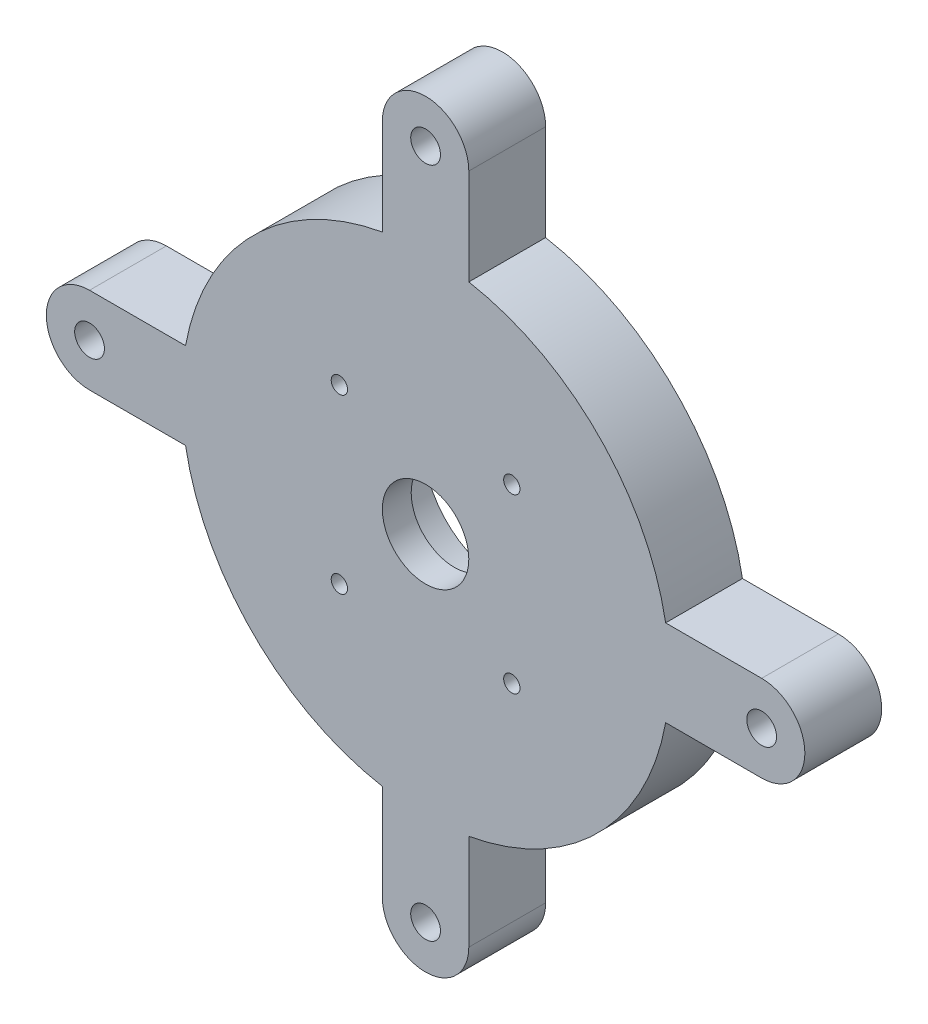
ISO-10303-21;
HEADER;
FILE_DESCRIPTION(('STEP AP214'),'2;1');
FILE_NAME('part.step','',(''),(''),'','','');
FILE_SCHEMA(('AUTOMOTIVE_DESIGN { 1 0 10303 214 1 1 1 1 }'));
ENDSEC;
DATA;
#1=APPLICATION_CONTEXT('core data for automotive mechanical design processes');
#2=APPLICATION_PROTOCOL_DEFINITION('international standard','automotive_design',2000,#1);
#3=PRODUCT_CONTEXT('',#1,'mechanical');
#4=PRODUCT('Part','Part','',(#3));
#5=PRODUCT_RELATED_PRODUCT_CATEGORY('part','',(#4));
#6=PRODUCT_DEFINITION_FORMATION('','',#4);
#7=PRODUCT_DEFINITION_CONTEXT('part definition',#1,'design');
#8=PRODUCT_DEFINITION('design','',#6,#7);
#9=PRODUCT_DEFINITION_SHAPE('','',#8);
#10=(LENGTH_UNIT() NAMED_UNIT(*) SI_UNIT(.MILLI.,.METRE.));
#11=(NAMED_UNIT(*) PLANE_ANGLE_UNIT() SI_UNIT($,.RADIAN.));
#12=(NAMED_UNIT(*) SI_UNIT($,.STERADIAN.) SOLID_ANGLE_UNIT());
#13=UNCERTAINTY_MEASURE_WITH_UNIT(LENGTH_MEASURE(1.E-05),#10,'distance_accuracy_value','');
#14=(GEOMETRIC_REPRESENTATION_CONTEXT(3) GLOBAL_UNCERTAINTY_ASSIGNED_CONTEXT((#13)) GLOBAL_UNIT_ASSIGNED_CONTEXT((#10,
#11,#12)) REPRESENTATION_CONTEXT('',''));
#15=CARTESIAN_POINT('',(0.,0.,0.));
#16=DIRECTION('',(0.,0.,1.));
#17=DIRECTION('',(1.,0.,0.));
#18=AXIS2_PLACEMENT_3D('',#15,#16,#17);
#19=CARTESIAN_POINT('',(0.,0.,8.));
#20=DIRECTION('',(0.,0.,-1.));
#21=DIRECTION('',(-1.,0.,0.));
#22=AXIS2_PLACEMENT_3D('',#19,#20,#21);
#23=CYLINDRICAL_SURFACE('',#22,4.5);
#24=CARTESIAN_POINT('',(0.,0.,8.));
#25=DIRECTION('',(0.,0.,1.));
#26=DIRECTION('',(1.,0.,0.));
#27=AXIS2_PLACEMENT_3D('',#24,#25,#26);
#28=CIRCLE('',#27,4.5);
#29=CARTESIAN_POINT('',(4.5,0.,8.));
#30=VERTEX_POINT('',#29);
#31=EDGE_CURVE('E308',#30,#30,#28,.T.);
#32=ORIENTED_EDGE('',*,*,#31,.T.);
#33=EDGE_LOOP('',(#32));
#34=FACE_BOUND('',#33,.T.);
#35=CARTESIAN_POINT('',(0.,0.,5.));
#36=DIRECTION('',(0.,0.,-1.));
#37=DIRECTION('',(-1.,0.,0.));
#38=AXIS2_PLACEMENT_3D('',#35,#36,#37);
#39=CIRCLE('',#38,4.5);
#40=CARTESIAN_POINT('',(-4.5,0.,5.));
#41=VERTEX_POINT('',#40);
#42=EDGE_CURVE('E252',#41,#41,#39,.T.);
#43=ORIENTED_EDGE('',*,*,#42,.T.);
#44=EDGE_LOOP('',(#43));
#45=FACE_BOUND('',#44,.T.);
#46=ADVANCED_FACE('F37',(#34,#45),#23,.F.);
#47=CARTESIAN_POINT('',(0.,0.,8.));
#48=DIRECTION('',(0.,0.,-1.));
#49=DIRECTION('',(-1.,0.,0.));
#50=AXIS2_PLACEMENT_3D('',#47,#48,#49);
#51=PLANE('',#50);
#52=CARTESIAN_POINT('',(0.,0.,8.));
#53=DIRECTION('',(0.,0.,1.));
#54=DIRECTION('',(-1.,0.,0.));
#55=AXIS2_PLACEMENT_3D('',#52,#53,#54);
#56=CIRCLE('',#55,25.4017715917611);
#57=CARTESIAN_POINT('',(-4.49999999999992,25.,8.));
#58=VERTEX_POINT('',#57);
#59=CARTESIAN_POINT('',(-25.,4.49999999999999,8.));
#60=VERTEX_POINT('',#59);
#61=EDGE_CURVE('E216',#58,#60,#56,.T.);
#62=ORIENTED_EDGE('',*,*,#61,.T.);
#63=DIRECTION('',(-1.,0.,0.));
#64=VECTOR('',#63,1.);
#65=CARTESIAN_POINT('',(-35.,4.5,8.));
#66=LINE('',#65,#64);
#67=CARTESIAN_POINT('',(-35.,4.5,8.));
#68=VERTEX_POINT('',#67);
#69=EDGE_CURVE('E123',#60,#68,#66,.T.);
#70=ORIENTED_EDGE('',*,*,#69,.T.);
#71=CARTESIAN_POINT('',(-35.,0.,8.));
#72=DIRECTION('',(0.,0.,1.));
#73=DIRECTION('',(1.,0.,0.));
#74=AXIS2_PLACEMENT_3D('',#71,#72,#73);
#75=CIRCLE('',#74,4.5);
#76=CARTESIAN_POINT('',(-35.,-4.5,8.));
#77=VERTEX_POINT('',#76);
#78=EDGE_CURVE('E318',#68,#77,#75,.T.);
#79=ORIENTED_EDGE('',*,*,#78,.T.);
#80=DIRECTION('',(1.,0.,0.));
#81=VECTOR('',#80,1.);
#82=CARTESIAN_POINT('',(-25.,-4.50000000000001,8.));
#83=LINE('',#82,#81);
#84=CARTESIAN_POINT('',(-25.,-4.5,8.));
#85=VERTEX_POINT('',#84);
#86=EDGE_CURVE('E320',#77,#85,#83,.T.);
#87=ORIENTED_EDGE('',*,*,#86,.T.);
#88=CARTESIAN_POINT('',(0.,0.,8.));
#89=DIRECTION('',(0.,0.,1.));
#90=DIRECTION('',(1.,0.,0.));
#91=AXIS2_PLACEMENT_3D('',#88,#89,#90);
#92=CIRCLE('',#91,25.4017715917611);
#93=CARTESIAN_POINT('',(-4.50000000000026,-25.,8.));
#94=VERTEX_POINT('',#93);
#95=EDGE_CURVE('E322',#85,#94,#92,.T.);
#96=ORIENTED_EDGE('',*,*,#95,.T.);
#97=DIRECTION('',(0.,-1.,0.));
#98=VECTOR('',#97,1.);
#99=CARTESIAN_POINT('',(-4.50000000000024,-35.,8.));
#100=LINE('',#99,#98);
#101=CARTESIAN_POINT('',(-4.50000000000024,-35.,8.));
#102=VERTEX_POINT('',#101);
#103=EDGE_CURVE('E324',#94,#102,#100,.T.);
#104=ORIENTED_EDGE('',*,*,#103,.T.);
#105=CARTESIAN_POINT('',(-2.4735030847392E-13,-35.,8.));
#106=DIRECTION('',(0.,0.,1.));
#107=DIRECTION('',(1.,0.,0.));
#108=AXIS2_PLACEMENT_3D('',#105,#106,#107);
#109=CIRCLE('',#108,4.5);
#110=CARTESIAN_POINT('',(4.49999999999975,-35.,8.));
#111=VERTEX_POINT('',#110);
#112=EDGE_CURVE('E326',#102,#111,#109,.T.);
#113=ORIENTED_EDGE('',*,*,#112,.T.);
#114=DIRECTION('',(0.,1.,0.));
#115=VECTOR('',#114,1.);
#116=CARTESIAN_POINT('',(4.49999999999974,-25.,8.));
#117=LINE('',#116,#115);
#118=CARTESIAN_POINT('',(4.49999999999974,-25.,8.));
#119=VERTEX_POINT('',#118);
#120=EDGE_CURVE('E328',#111,#119,#117,.T.);
#121=ORIENTED_EDGE('',*,*,#120,.T.);
#122=CARTESIAN_POINT('',(0.,0.,8.));
#123=DIRECTION('',(0.,0.,1.));
#124=DIRECTION('',(1.,0.,0.));
#125=AXIS2_PLACEMENT_3D('',#122,#123,#124);
#126=CIRCLE('',#125,25.4017715917611);
#127=CARTESIAN_POINT('',(25.,-4.50000000000017,8.));
#128=VERTEX_POINT('',#127);
#129=EDGE_CURVE('E330',#119,#128,#126,.T.);
#130=ORIENTED_EDGE('',*,*,#129,.T.);
#131=DIRECTION('',(1.,0.,0.));
#132=VECTOR('',#131,1.);
#133=CARTESIAN_POINT('',(34.9999999999997,-4.5000000000002,8.));
#134=LINE('',#133,#132);
#135=CARTESIAN_POINT('',(34.9999999999997,-4.5000000000002,8.));
#136=VERTEX_POINT('',#135);
#137=EDGE_CURVE('E332',#128,#136,#134,.T.);
#138=ORIENTED_EDGE('',*,*,#137,.T.);
#139=CARTESIAN_POINT('',(34.9999999999997,-2.06125353473007E-13,8.));
#140=DIRECTION('',(0.,0.,1.));
#141=DIRECTION('',(1.,0.,0.));
#142=AXIS2_PLACEMENT_3D('',#139,#140,#141);
#143=CIRCLE('',#142,4.5);
#144=CARTESIAN_POINT('',(34.9999999999997,4.49999999999979,8.));
#145=VERTEX_POINT('',#144);
#146=EDGE_CURVE('E334',#136,#145,#143,.T.);
#147=ORIENTED_EDGE('',*,*,#146,.T.);
#148=DIRECTION('',(-1.,0.,0.));
#149=VECTOR('',#148,1.);
#150=CARTESIAN_POINT('',(25.,4.49999999999983,8.));
#151=LINE('',#150,#149);
#152=CARTESIAN_POINT('',(25.,4.49999999999983,8.));
#153=VERTEX_POINT('',#152);
#154=EDGE_CURVE('E336',#145,#153,#151,.T.);
#155=ORIENTED_EDGE('',*,*,#154,.T.);
#156=CARTESIAN_POINT('',(0.,0.,8.));
#157=DIRECTION('',(0.,0.,1.));
#158=DIRECTION('',(1.,0.,0.));
#159=AXIS2_PLACEMENT_3D('',#156,#157,#158);
#160=CIRCLE('',#159,25.4017715917611);
#161=CARTESIAN_POINT('',(4.50000000000008,25.,8.));
#162=VERTEX_POINT('',#161);
#163=EDGE_CURVE('E167',#153,#162,#160,.T.);
#164=ORIENTED_EDGE('',*,*,#163,.T.);
#165=DIRECTION('',(0.,1.,0.));
#166=VECTOR('',#165,1.);
#167=CARTESIAN_POINT('',(4.49999999999995,34.9999999999997,8.));
#168=LINE('',#167,#166);
#169=CARTESIAN_POINT('',(4.49999999999995,34.9999999999997,8.));
#170=VERTEX_POINT('',#169);
#171=EDGE_CURVE('E160',#162,#170,#168,.T.);
#172=ORIENTED_EDGE('',*,*,#171,.T.);
#173=CARTESIAN_POINT('',(0.,34.9999999999997,8.));
#174=DIRECTION('',(0.,0.,1.));
#175=DIRECTION('',(1.,0.,0.));
#176=AXIS2_PLACEMENT_3D('',#173,#174,#175);
#177=CIRCLE('',#176,4.5);
#178=CARTESIAN_POINT('',(-4.50000000000004,34.9999999999997,8.));
#179=VERTEX_POINT('',#178);
#180=EDGE_CURVE('E165',#170,#179,#177,.T.);
#181=ORIENTED_EDGE('',*,*,#180,.T.);
#182=DIRECTION('',(0.,-1.,0.));
#183=VECTOR('',#182,1.);
#184=CARTESIAN_POINT('',(-4.49999999999992,25.,8.));
#185=LINE('',#184,#183);
#186=EDGE_CURVE('E56',#179,#58,#185,.T.);
#187=ORIENTED_EDGE('',*,*,#186,.T.);
#188=EDGE_LOOP('',(#62,#70,#79,#87,#96,#104,#113,#121,#130,#138,#147,#155,#164,#172,#181,#187));
#189=FACE_BOUND('',#188,.T.);
#190=CARTESIAN_POINT('',(8.98025612106914,8.98025612106917,8.));
#191=DIRECTION('',(0.,0.,1.));
#192=DIRECTION('',(1.,0.,0.));
#193=AXIS2_PLACEMENT_3D('',#190,#191,#192);
#194=CIRCLE('',#193,0.85);
#195=CARTESIAN_POINT('',(9.83025612106914,8.98025612106917,8.));
#196=VERTEX_POINT('',#195);
#197=EDGE_CURVE('E189',#196,#196,#194,.T.);
#198=ORIENTED_EDGE('',*,*,#197,.F.);
#199=EDGE_LOOP('',(#198));
#200=FACE_BOUND('',#199,.T.);
#201=ORIENTED_EDGE('',*,*,#31,.F.);
#202=EDGE_LOOP('',(#201));
#203=FACE_BOUND('',#202,.T.);
#204=CARTESIAN_POINT('',(0.,34.9999999999997,8.));
#205=DIRECTION('',(0.,0.,1.));
#206=DIRECTION('',(1.,0.,0.));
#207=AXIS2_PLACEMENT_3D('',#204,#205,#206);
#208=CIRCLE('',#207,1.54999999999999);
#209=CARTESIAN_POINT('',(1.54999999999995,34.9999999999997,8.));
#210=VERTEX_POINT('',#209);
#211=EDGE_CURVE('E305',#210,#210,#208,.T.);
#212=ORIENTED_EDGE('',*,*,#211,.F.);
#213=EDGE_LOOP('',(#212));
#214=FACE_BOUND('',#213,.T.);
#215=CARTESIAN_POINT('',(-35.,0.,8.));
#216=DIRECTION('',(0.,0.,1.));
#217=DIRECTION('',(1.,0.,0.));
#218=AXIS2_PLACEMENT_3D('',#215,#216,#217);
#219=CIRCLE('',#218,1.55);
#220=CARTESIAN_POINT('',(-33.45,0.,8.));
#221=VERTEX_POINT('',#220);
#222=EDGE_CURVE('E300',#221,#221,#219,.T.);
#223=ORIENTED_EDGE('',*,*,#222,.F.);
#224=EDGE_LOOP('',(#223));
#225=FACE_BOUND('',#224,.T.);
#226=CARTESIAN_POINT('',(8.98025612106965,-8.98025612106915,8.));
#227=DIRECTION('',(0.,0.,1.));
#228=DIRECTION('',(1.,0.,0.));
#229=AXIS2_PLACEMENT_3D('',#226,#227,#228);
#230=CIRCLE('',#229,0.85);
#231=CARTESIAN_POINT('',(9.83025612106965,-8.98025612106915,8.));
#232=VERTEX_POINT('',#231);
#233=EDGE_CURVE('E297',#232,#232,#230,.T.);
#234=ORIENTED_EDGE('',*,*,#233,.F.);
#235=EDGE_LOOP('',(#234));
#236=FACE_BOUND('',#235,.T.);
#237=CARTESIAN_POINT('',(-8.98025612106865,-8.98025612106965,8.));
#238=DIRECTION('',(0.,0.,1.));
#239=DIRECTION('',(1.,0.,0.));
#240=AXIS2_PLACEMENT_3D('',#237,#238,#239);
#241=CIRCLE('',#240,0.85);
#242=CARTESIAN_POINT('',(-8.13025612106865,-8.98025612106965,8.));
#243=VERTEX_POINT('',#242);
#244=EDGE_CURVE('E291',#243,#243,#241,.T.);
#245=ORIENTED_EDGE('',*,*,#244,.F.);
#246=EDGE_LOOP('',(#245));
#247=FACE_BOUND('',#246,.T.);
#248=CARTESIAN_POINT('',(-8.98025612106915,8.98025612106865,8.));
#249=DIRECTION('',(0.,0.,1.));
#250=DIRECTION('',(1.,0.,0.));
#251=AXIS2_PLACEMENT_3D('',#248,#249,#250);
#252=CIRCLE('',#251,0.85);
#253=CARTESIAN_POINT('',(-8.13025612106915,8.98025612106865,8.));
#254=VERTEX_POINT('',#253);
#255=EDGE_CURVE('E285',#254,#254,#252,.T.);
#256=ORIENTED_EDGE('',*,*,#255,.F.);
#257=EDGE_LOOP('',(#256));
#258=FACE_BOUND('',#257,.T.);
#259=CARTESIAN_POINT('',(34.9999999999997,-2.06125353473007E-13,8.));
#260=DIRECTION('',(0.,0.,1.));
#261=DIRECTION('',(1.,0.,0.));
#262=AXIS2_PLACEMENT_3D('',#259,#260,#261);
#263=CIRCLE('',#262,1.54999999999999);
#264=CARTESIAN_POINT('',(36.5499999999997,-2.06125353473007E-13,8.));
#265=VERTEX_POINT('',#264);
#266=EDGE_CURVE('E281',#265,#265,#263,.T.);
#267=ORIENTED_EDGE('',*,*,#266,.F.);
#268=EDGE_LOOP('',(#267));
#269=FACE_BOUND('',#268,.T.);
#270=CARTESIAN_POINT('',(-2.4735030847392E-13,-35.,8.));
#271=DIRECTION('',(0.,0.,1.));
#272=DIRECTION('',(1.,0.,0.));
#273=AXIS2_PLACEMENT_3D('',#270,#271,#272);
#274=CIRCLE('',#273,1.55);
#275=CARTESIAN_POINT('',(1.54999999999976,-35.,8.));
#276=VERTEX_POINT('',#275);
#277=EDGE_CURVE('E255',#276,#276,#274,.T.);
#278=ORIENTED_EDGE('',*,*,#277,.F.);
#279=EDGE_LOOP('',(#278));
#280=FACE_BOUND('',#279,.T.);
#281=ADVANCED_FACE('F162',(#189,#200,#203,#214,#225,#236,#247,#258,#269,#280),#51,.F.);
#282=CARTESIAN_POINT('',(0.,0.,0.));
#283=DIRECTION('',(0.,0.,-1.));
#284=DIRECTION('',(-1.,0.,0.));
#285=AXIS2_PLACEMENT_3D('',#282,#283,#284);
#286=PLANE('',#285);
#287=CARTESIAN_POINT('',(0.,34.9999999999997,0.));
#288=DIRECTION('',(0.,0.,1.));
#289=DIRECTION('',(1.,0.,0.));
#290=AXIS2_PLACEMENT_3D('',#287,#288,#289);
#291=CIRCLE('',#290,3.5);
#292=CARTESIAN_POINT('',(3.49999999999996,34.9999999999997,0.));
#293=VERTEX_POINT('',#292);
#294=EDGE_CURVE('E387',#293,#293,#291,.T.);
#295=ORIENTED_EDGE('',*,*,#294,.T.);
#296=EDGE_LOOP('',(#295));
#297=FACE_BOUND('',#296,.T.);
#298=CARTESIAN_POINT('',(35.0000000000007,1.05264605564613E-12,0.));
#299=DIRECTION('',(0.,0.,1.));
#300=DIRECTION('',(1.,0.,0.));
#301=AXIS2_PLACEMENT_3D('',#298,#299,#300);
#302=CIRCLE('',#301,3.50000000000079);
#303=CARTESIAN_POINT('',(38.5000000000015,1.05264605564613E-12,0.));
#304=VERTEX_POINT('',#303);
#305=EDGE_CURVE('E391',#304,#304,#302,.T.);
#306=ORIENTED_EDGE('',*,*,#305,.T.);
#307=EDGE_LOOP('',(#306));
#308=FACE_BOUND('',#307,.T.);
#309=CARTESIAN_POINT('',(2.05855624569518E-12,-34.9999999999997,0.));
#310=DIRECTION('',(0.,0.,1.));
#311=DIRECTION('',(1.,0.,0.));
#312=AXIS2_PLACEMENT_3D('',#309,#310,#311);
#313=CIRCLE('',#312,3.50000000000216);
#314=CARTESIAN_POINT('',(3.50000000000422,-34.9999999999997,0.));
#315=VERTEX_POINT('',#314);
#316=EDGE_CURVE('E395',#315,#315,#313,.T.);
#317=ORIENTED_EDGE('',*,*,#316,.T.);
#318=EDGE_LOOP('',(#317));
#319=FACE_BOUND('',#318,.T.);
#320=CARTESIAN_POINT('',(-34.9999999999987,-1.05693231944314E-12,0.));
#321=DIRECTION('',(0.,0.,1.));
#322=DIRECTION('',(1.,0.,0.));
#323=AXIS2_PLACEMENT_3D('',#320,#321,#322);
#324=CIRCLE('',#323,3.50000000000161);
#325=CARTESIAN_POINT('',(-31.4999999999971,-1.05693231944314E-12,0.));
#326=VERTEX_POINT('',#325);
#327=EDGE_CURVE('E399',#326,#326,#324,.T.);
#328=ORIENTED_EDGE('',*,*,#327,.T.);
#329=EDGE_LOOP('',(#328));
#330=FACE_BOUND('',#329,.T.);
#331=CARTESIAN_POINT('',(0.,0.,0.));
#332=DIRECTION('',(0.,0.,-1.));
#333=DIRECTION('',(-1.,0.,0.));
#334=AXIS2_PLACEMENT_3D('',#331,#332,#333);
#335=CIRCLE('',#334,8.2);
#336=CARTESIAN_POINT('',(-8.2,0.,0.));
#337=VERTEX_POINT('',#336);
#338=EDGE_CURVE('E268',#337,#337,#335,.T.);
#339=ORIENTED_EDGE('',*,*,#338,.F.);
#340=EDGE_LOOP('',(#339));
#341=FACE_BOUND('',#340,.T.);
#342=CARTESIAN_POINT('',(-8.98025612106865,-8.98025612106965,0.));
#343=DIRECTION('',(0.,0.,1.));
#344=DIRECTION('',(1.,0.,0.));
#345=AXIS2_PLACEMENT_3D('',#342,#343,#344);
#346=CIRCLE('',#345,0.85);
#347=CARTESIAN_POINT('',(-8.13025612106865,-8.98025612106965,0.));
#348=VERTEX_POINT('',#347);
#349=EDGE_CURVE('E288',#348,#348,#346,.T.);
#350=ORIENTED_EDGE('',*,*,#349,.T.);
#351=EDGE_LOOP('',(#350));
#352=FACE_BOUND('',#351,.T.);
#353=CARTESIAN_POINT('',(0.,0.,0.));
#354=DIRECTION('',(0.,0.,1.));
#355=DIRECTION('',(-1.,0.,0.));
#356=AXIS2_PLACEMENT_3D('',#353,#354,#355);
#357=CIRCLE('',#356,25.4017715917611);
#358=CARTESIAN_POINT('',(-4.49999999999992,25.,0.));
#359=VERTEX_POINT('',#358);
#360=CARTESIAN_POINT('',(-25.,4.49999999999999,0.));
#361=VERTEX_POINT('',#360);
#362=EDGE_CURVE('E185',#359,#361,#357,.T.);
#363=ORIENTED_EDGE('',*,*,#362,.F.);
#364=DIRECTION('',(0.,-1.,0.));
#365=VECTOR('',#364,1.);
#366=CARTESIAN_POINT('',(-4.49999999999992,25.,0.));
#367=LINE('',#366,#365);
#368=CARTESIAN_POINT('',(-4.50000000000004,34.9999999999997,0.));
#369=VERTEX_POINT('',#368);
#370=EDGE_CURVE('E115',#369,#359,#367,.T.);
#371=ORIENTED_EDGE('',*,*,#370,.F.);
#372=CARTESIAN_POINT('',(0.,34.9999999999997,0.));
#373=DIRECTION('',(0.,0.,1.));
#374=DIRECTION('',(1.,0.,0.));
#375=AXIS2_PLACEMENT_3D('',#372,#373,#374);
#376=CIRCLE('',#375,4.5);
#377=CARTESIAN_POINT('',(4.49999999999995,34.9999999999997,0.));
#378=VERTEX_POINT('',#377);
#379=EDGE_CURVE('E109',#378,#369,#376,.T.);
#380=ORIENTED_EDGE('',*,*,#379,.F.);
#381=DIRECTION('',(0.,1.,0.));
#382=VECTOR('',#381,1.);
#383=CARTESIAN_POINT('',(4.49999999999995,34.9999999999997,0.));
#384=LINE('',#383,#382);
#385=CARTESIAN_POINT('',(4.50000000000008,25.,0.));
#386=VERTEX_POINT('',#385);
#387=EDGE_CURVE('E175',#386,#378,#384,.T.);
#388=ORIENTED_EDGE('',*,*,#387,.F.);
#389=CARTESIAN_POINT('',(0.,0.,0.));
#390=DIRECTION('',(0.,0.,1.));
#391=DIRECTION('',(1.,0.,0.));
#392=AXIS2_PLACEMENT_3D('',#389,#390,#391);
#393=CIRCLE('',#392,25.4017715917611);
#394=CARTESIAN_POINT('',(25.,4.49999999999983,0.));
#395=VERTEX_POINT('',#394);
#396=EDGE_CURVE('E211',#395,#386,#393,.T.);
#397=ORIENTED_EDGE('',*,*,#396,.F.);
#398=DIRECTION('',(-1.,0.,0.));
#399=VECTOR('',#398,1.);
#400=CARTESIAN_POINT('',(25.,4.49999999999983,0.));
#401=LINE('',#400,#399);
#402=CARTESIAN_POINT('',(34.9999999999997,4.49999999999979,0.));
#403=VERTEX_POINT('',#402);
#404=EDGE_CURVE('E209',#403,#395,#401,.T.);
#405=ORIENTED_EDGE('',*,*,#404,.F.);
#406=CARTESIAN_POINT('',(34.9999999999997,-2.06125353473007E-13,0.));
#407=DIRECTION('',(0.,0.,1.));
#408=DIRECTION('',(1.,0.,0.));
#409=AXIS2_PLACEMENT_3D('',#406,#407,#408);
#410=CIRCLE('',#409,4.5);
#411=CARTESIAN_POINT('',(34.9999999999997,-4.5000000000002,0.));
#412=VERTEX_POINT('',#411);
#413=EDGE_CURVE('E207',#412,#403,#410,.T.);
#414=ORIENTED_EDGE('',*,*,#413,.F.);
#415=DIRECTION('',(1.,0.,0.));
#416=VECTOR('',#415,1.);
#417=CARTESIAN_POINT('',(34.9999999999997,-4.5000000000002,0.));
#418=LINE('',#417,#416);
#419=CARTESIAN_POINT('',(25.,-4.50000000000017,0.));
#420=VERTEX_POINT('',#419);
#421=EDGE_CURVE('E205',#420,#412,#418,.T.);
#422=ORIENTED_EDGE('',*,*,#421,.F.);
#423=CARTESIAN_POINT('',(0.,0.,0.));
#424=DIRECTION('',(0.,0.,1.));
#425=DIRECTION('',(1.,0.,0.));
#426=AXIS2_PLACEMENT_3D('',#423,#424,#425);
#427=CIRCLE('',#426,25.4017715917611);
#428=CARTESIAN_POINT('',(4.49999999999974,-25.,0.));
#429=VERTEX_POINT('',#428);
#430=EDGE_CURVE('E203',#429,#420,#427,.T.);
#431=ORIENTED_EDGE('',*,*,#430,.F.);
#432=DIRECTION('',(0.,1.,0.));
#433=VECTOR('',#432,1.);
#434=CARTESIAN_POINT('',(4.49999999999974,-25.,0.));
#435=LINE('',#434,#433);
#436=CARTESIAN_POINT('',(4.49999999999975,-35.,0.));
#437=VERTEX_POINT('',#436);
#438=EDGE_CURVE('E201',#437,#429,#435,.T.);
#439=ORIENTED_EDGE('',*,*,#438,.F.);
#440=CARTESIAN_POINT('',(-2.4735030847392E-13,-35.,0.));
#441=DIRECTION('',(0.,0.,1.));
#442=DIRECTION('',(1.,0.,0.));
#443=AXIS2_PLACEMENT_3D('',#440,#441,#442);
#444=CIRCLE('',#443,4.5);
#445=CARTESIAN_POINT('',(-4.50000000000024,-35.,0.));
#446=VERTEX_POINT('',#445);
#447=EDGE_CURVE('E199',#446,#437,#444,.T.);
#448=ORIENTED_EDGE('',*,*,#447,.F.);
#449=DIRECTION('',(0.,-1.,0.));
#450=VECTOR('',#449,1.);
#451=CARTESIAN_POINT('',(-4.50000000000024,-35.,0.));
#452=LINE('',#451,#450);
#453=CARTESIAN_POINT('',(-4.50000000000026,-25.,0.));
#454=VERTEX_POINT('',#453);
#455=EDGE_CURVE('E197',#454,#446,#452,.T.);
#456=ORIENTED_EDGE('',*,*,#455,.F.);
#457=CARTESIAN_POINT('',(0.,0.,0.));
#458=DIRECTION('',(0.,0.,1.));
#459=DIRECTION('',(1.,0.,0.));
#460=AXIS2_PLACEMENT_3D('',#457,#458,#459);
#461=CIRCLE('',#460,25.4017715917611);
#462=CARTESIAN_POINT('',(-25.,-4.5,0.));
#463=VERTEX_POINT('',#462);
#464=EDGE_CURVE('E195',#463,#454,#461,.T.);
#465=ORIENTED_EDGE('',*,*,#464,.F.);
#466=DIRECTION('',(1.,0.,0.));
#467=VECTOR('',#466,1.);
#468=CARTESIAN_POINT('',(-25.,-4.50000000000001,0.));
#469=LINE('',#468,#467);
#470=CARTESIAN_POINT('',(-35.,-4.5,0.));
#471=VERTEX_POINT('',#470);
#472=EDGE_CURVE('E193',#471,#463,#469,.T.);
#473=ORIENTED_EDGE('',*,*,#472,.F.);
#474=CARTESIAN_POINT('',(-35.,0.,0.));
#475=DIRECTION('',(0.,0.,1.));
#476=DIRECTION('',(1.,0.,0.));
#477=AXIS2_PLACEMENT_3D('',#474,#475,#476);
#478=CIRCLE('',#477,4.5);
#479=CARTESIAN_POINT('',(-35.,4.5,0.));
#480=VERTEX_POINT('',#479);
#481=EDGE_CURVE('E191',#480,#471,#478,.T.);
#482=ORIENTED_EDGE('',*,*,#481,.F.);
#483=DIRECTION('',(-1.,0.,0.));
#484=VECTOR('',#483,1.);
#485=CARTESIAN_POINT('',(-35.,4.5,0.));
#486=LINE('',#485,#484);
#487=EDGE_CURVE('E188',#361,#480,#486,.T.);
#488=ORIENTED_EDGE('',*,*,#487,.F.);
#489=EDGE_LOOP('',(#363,#371,#380,#388,#397,#405,#414,#422,#431,#439,#448,#456,#465,#473,#482,#488));
#490=FACE_BOUND('',#489,.T.);
#491=CARTESIAN_POINT('',(8.98025612106914,8.98025612106917,0.));
#492=DIRECTION('',(0.,0.,1.));
#493=DIRECTION('',(1.,0.,0.));
#494=AXIS2_PLACEMENT_3D('',#491,#492,#493);
#495=CIRCLE('',#494,0.85);
#496=CARTESIAN_POINT('',(9.83025612106914,8.98025612106917,0.));
#497=VERTEX_POINT('',#496);
#498=EDGE_CURVE('E311',#497,#497,#495,.T.);
#499=ORIENTED_EDGE('',*,*,#498,.T.);
#500=EDGE_LOOP('',(#499));
#501=FACE_BOUND('',#500,.T.);
#502=CARTESIAN_POINT('',(8.98025612106965,-8.98025612106915,0.));
#503=DIRECTION('',(0.,0.,1.));
#504=DIRECTION('',(1.,0.,0.));
#505=AXIS2_PLACEMENT_3D('',#502,#503,#504);
#506=CIRCLE('',#505,0.85);
#507=CARTESIAN_POINT('',(9.83025612106965,-8.98025612106915,0.));
#508=VERTEX_POINT('',#507);
#509=EDGE_CURVE('E294',#508,#508,#506,.T.);
#510=ORIENTED_EDGE('',*,*,#509,.T.);
#511=EDGE_LOOP('',(#510));
#512=FACE_BOUND('',#511,.T.);
#513=CARTESIAN_POINT('',(-8.98025612106915,8.98025612106865,0.));
#514=DIRECTION('',(0.,0.,1.));
#515=DIRECTION('',(1.,0.,0.));
#516=AXIS2_PLACEMENT_3D('',#513,#514,#515);
#517=CIRCLE('',#516,0.85);
#518=CARTESIAN_POINT('',(-8.13025612106915,8.98025612106865,0.));
#519=VERTEX_POINT('',#518);
#520=EDGE_CURVE('E284',#519,#519,#517,.T.);
#521=ORIENTED_EDGE('',*,*,#520,.T.);
#522=EDGE_LOOP('',(#521));
#523=FACE_BOUND('',#522,.T.);
#524=ADVANCED_FACE('F349',(#297,#308,#319,#330,#341,#352,#490,#501,#512,#523),#286,.T.);
#525=CARTESIAN_POINT('',(0.,0.,8.));
#526=DIRECTION('',(0.,0.,-1.));
#527=DIRECTION('',(-1.,0.,0.));
#528=AXIS2_PLACEMENT_3D('',#525,#526,#527);
#529=CYLINDRICAL_SURFACE('',#528,25.4017715917611);
#530=ORIENTED_EDGE('',*,*,#362,.T.);
#531=DIRECTION('',(0.,0.,-1.));
#532=VECTOR('',#531,1.);
#533=CARTESIAN_POINT('',(-25.,4.49999999999999,8.));
#534=LINE('',#533,#532);
#535=EDGE_CURVE('E11',#60,#361,#534,.T.);
#536=ORIENTED_EDGE('',*,*,#535,.F.);
#537=ORIENTED_EDGE('',*,*,#61,.F.);
#538=DIRECTION('',(0.,0.,-1.));
#539=VECTOR('',#538,1.);
#540=CARTESIAN_POINT('',(-4.49999999999992,25.,8.));
#541=LINE('',#540,#539);
#542=EDGE_CURVE('E181',#58,#359,#541,.T.);
#543=ORIENTED_EDGE('',*,*,#542,.T.);
#544=EDGE_LOOP('',(#530,#536,#537,#543));
#545=FACE_BOUND('',#544,.T.);
#546=ADVANCED_FACE('F39',(#545),#529,.T.);
#547=CARTESIAN_POINT('',(-35.,4.5,8.));
#548=DIRECTION('',(0.,-1.,0.));
#549=DIRECTION('',(1.,0.,0.));
#550=AXIS2_PLACEMENT_3D('',#547,#548,#549);
#551=PLANE('',#550);
#552=ORIENTED_EDGE('',*,*,#487,.T.);
#553=DIRECTION('',(0.,0.,-1.));
#554=VECTOR('',#553,1.);
#555=CARTESIAN_POINT('',(-35.,4.5,8.));
#556=LINE('',#555,#554);
#557=EDGE_CURVE('E47',#68,#480,#556,.T.);
#558=ORIENTED_EDGE('',*,*,#557,.F.);
#559=ORIENTED_EDGE('',*,*,#69,.F.);
#560=ORIENTED_EDGE('',*,*,#535,.T.);
#561=EDGE_LOOP('',(#552,#558,#559,#560));
#562=FACE_BOUND('',#561,.T.);
#563=ADVANCED_FACE('F383',(#562),#551,.F.);
#564=CARTESIAN_POINT('',(-35.,0.,8.));
#565=DIRECTION('',(0.,0.,-1.));
#566=DIRECTION('',(-1.,0.,0.));
#567=AXIS2_PLACEMENT_3D('',#564,#565,#566);
#568=CYLINDRICAL_SURFACE('',#567,4.5);
#569=ORIENTED_EDGE('',*,*,#481,.T.);
#570=DIRECTION('',(0.,0.,-1.));
#571=VECTOR('',#570,1.);
#572=CARTESIAN_POINT('',(-35.,-4.5,8.));
#573=LINE('',#572,#571);
#574=EDGE_CURVE('E247',#77,#471,#573,.T.);
#575=ORIENTED_EDGE('',*,*,#574,.F.);
#576=ORIENTED_EDGE('',*,*,#78,.F.);
#577=ORIENTED_EDGE('',*,*,#557,.T.);
#578=EDGE_LOOP('',(#569,#575,#576,#577));
#579=FACE_BOUND('',#578,.T.);
#580=ADVANCED_FACE('F695',(#579),#568,.T.);
#581=CARTESIAN_POINT('',(-25.,-4.50000000000001,8.));
#582=DIRECTION('',(0.,1.,0.));
#583=DIRECTION('',(-1.,0.,0.));
#584=AXIS2_PLACEMENT_3D('',#581,#582,#583);
#585=PLANE('',#584);
#586=ORIENTED_EDGE('',*,*,#472,.T.);
#587=DIRECTION('',(0.,0.,-1.));
#588=VECTOR('',#587,1.);
#589=CARTESIAN_POINT('',(-25.,-4.5,8.));
#590=LINE('',#589,#588);
#591=EDGE_CURVE('E244',#85,#463,#590,.T.);
#592=ORIENTED_EDGE('',*,*,#591,.F.);
#593=ORIENTED_EDGE('',*,*,#86,.F.);
#594=ORIENTED_EDGE('',*,*,#574,.T.);
#595=EDGE_LOOP('',(#586,#592,#593,#594));
#596=FACE_BOUND('',#595,.T.);
#597=ADVANCED_FACE('F685',(#596),#585,.F.);
#598=CARTESIAN_POINT('',(0.,0.,8.));
#599=DIRECTION('',(0.,0.,-1.));
#600=DIRECTION('',(-1.,0.,0.));
#601=AXIS2_PLACEMENT_3D('',#598,#599,#600);
#602=CYLINDRICAL_SURFACE('',#601,25.4017715917611);
#603=ORIENTED_EDGE('',*,*,#464,.T.);
#604=DIRECTION('',(0.,0.,-1.));
#605=VECTOR('',#604,1.);
#606=CARTESIAN_POINT('',(-4.50000000000026,-25.,8.));
#607=LINE('',#606,#605);
#608=EDGE_CURVE('E241',#94,#454,#607,.T.);
#609=ORIENTED_EDGE('',*,*,#608,.F.);
#610=ORIENTED_EDGE('',*,*,#95,.F.);
#611=ORIENTED_EDGE('',*,*,#591,.T.);
#612=EDGE_LOOP('',(#603,#609,#610,#611));
#613=FACE_BOUND('',#612,.T.);
#614=ADVANCED_FACE('F675',(#613),#602,.T.);
#615=CARTESIAN_POINT('',(-4.50000000000024,-35.,8.));
#616=DIRECTION('',(1.,0.,0.));
#617=DIRECTION('',(0.,1.,0.));
#618=AXIS2_PLACEMENT_3D('',#615,#616,#617);
#619=PLANE('',#618);
#620=ORIENTED_EDGE('',*,*,#455,.T.);
#621=DIRECTION('',(0.,0.,-1.));
#622=VECTOR('',#621,1.);
#623=CARTESIAN_POINT('',(-4.50000000000024,-35.,8.));
#624=LINE('',#623,#622);
#625=EDGE_CURVE('E238',#102,#446,#624,.T.);
#626=ORIENTED_EDGE('',*,*,#625,.F.);
#627=ORIENTED_EDGE('',*,*,#103,.F.);
#628=ORIENTED_EDGE('',*,*,#608,.T.);
#629=EDGE_LOOP('',(#620,#626,#627,#628));
#630=FACE_BOUND('',#629,.T.);
#631=ADVANCED_FACE('F665',(#630),#619,.F.);
#632=CARTESIAN_POINT('',(-2.4735030847392E-13,-35.,8.));
#633=DIRECTION('',(0.,0.,-1.));
#634=DIRECTION('',(-1.,0.,0.));
#635=AXIS2_PLACEMENT_3D('',#632,#633,#634);
#636=CYLINDRICAL_SURFACE('',#635,4.5);
#637=ORIENTED_EDGE('',*,*,#447,.T.);
#638=DIRECTION('',(0.,0.,-1.));
#639=VECTOR('',#638,1.);
#640=CARTESIAN_POINT('',(4.49999999999975,-35.,8.));
#641=LINE('',#640,#639);
#642=EDGE_CURVE('E235',#111,#437,#641,.T.);
#643=ORIENTED_EDGE('',*,*,#642,.F.);
#644=ORIENTED_EDGE('',*,*,#112,.F.);
#645=ORIENTED_EDGE('',*,*,#625,.T.);
#646=EDGE_LOOP('',(#637,#643,#644,#645));
#647=FACE_BOUND('',#646,.T.);
#648=ADVANCED_FACE('F655',(#647),#636,.T.);
#649=CARTESIAN_POINT('',(4.49999999999974,-25.,8.));
#650=DIRECTION('',(-1.,0.,0.));
#651=DIRECTION('',(0.,-1.,0.));
#652=AXIS2_PLACEMENT_3D('',#649,#650,#651);
#653=PLANE('',#652);
#654=ORIENTED_EDGE('',*,*,#438,.T.);
#655=DIRECTION('',(0.,0.,-1.));
#656=VECTOR('',#655,1.);
#657=CARTESIAN_POINT('',(4.49999999999974,-25.,8.));
#658=LINE('',#657,#656);
#659=EDGE_CURVE('E232',#119,#429,#658,.T.);
#660=ORIENTED_EDGE('',*,*,#659,.F.);
#661=ORIENTED_EDGE('',*,*,#120,.F.);
#662=ORIENTED_EDGE('',*,*,#642,.T.);
#663=EDGE_LOOP('',(#654,#660,#661,#662));
#664=FACE_BOUND('',#663,.T.);
#665=ADVANCED_FACE('F645',(#664),#653,.F.);
#666=CARTESIAN_POINT('',(0.,0.,8.));
#667=DIRECTION('',(0.,0.,-1.));
#668=DIRECTION('',(-1.,0.,0.));
#669=AXIS2_PLACEMENT_3D('',#666,#667,#668);
#670=CYLINDRICAL_SURFACE('',#669,25.4017715917611);
#671=ORIENTED_EDGE('',*,*,#430,.T.);
#672=DIRECTION('',(0.,0.,-1.));
#673=VECTOR('',#672,1.);
#674=CARTESIAN_POINT('',(25.,-4.50000000000017,8.));
#675=LINE('',#674,#673);
#676=EDGE_CURVE('E229',#128,#420,#675,.T.);
#677=ORIENTED_EDGE('',*,*,#676,.F.);
#678=ORIENTED_EDGE('',*,*,#129,.F.);
#679=ORIENTED_EDGE('',*,*,#659,.T.);
#680=EDGE_LOOP('',(#671,#677,#678,#679));
#681=FACE_BOUND('',#680,.T.);
#682=ADVANCED_FACE('F635',(#681),#670,.T.);
#683=CARTESIAN_POINT('',(34.9999999999997,-4.5000000000002,8.));
#684=DIRECTION('',(0.,1.,0.));
#685=DIRECTION('',(-1.,0.,0.));
#686=AXIS2_PLACEMENT_3D('',#683,#684,#685);
#687=PLANE('',#686);
#688=ORIENTED_EDGE('',*,*,#421,.T.);
#689=DIRECTION('',(0.,0.,-1.));
#690=VECTOR('',#689,1.);
#691=CARTESIAN_POINT('',(34.9999999999997,-4.5000000000002,8.));
#692=LINE('',#691,#690);
#693=EDGE_CURVE('E226',#136,#412,#692,.T.);
#694=ORIENTED_EDGE('',*,*,#693,.F.);
#695=ORIENTED_EDGE('',*,*,#137,.F.);
#696=ORIENTED_EDGE('',*,*,#676,.T.);
#697=EDGE_LOOP('',(#688,#694,#695,#696));
#698=FACE_BOUND('',#697,.T.);
#699=ADVANCED_FACE('F625',(#698),#687,.F.);
#700=CARTESIAN_POINT('',(34.9999999999997,-2.06125353473007E-13,8.));
#701=DIRECTION('',(0.,0.,-1.));
#702=DIRECTION('',(-1.,0.,0.));
#703=AXIS2_PLACEMENT_3D('',#700,#701,#702);
#704=CYLINDRICAL_SURFACE('',#703,4.5);
#705=ORIENTED_EDGE('',*,*,#413,.T.);
#706=DIRECTION('',(0.,0.,-1.));
#707=VECTOR('',#706,1.);
#708=CARTESIAN_POINT('',(34.9999999999997,4.49999999999979,8.));
#709=LINE('',#708,#707);
#710=EDGE_CURVE('E223',#145,#403,#709,.T.);
#711=ORIENTED_EDGE('',*,*,#710,.F.);
#712=ORIENTED_EDGE('',*,*,#146,.F.);
#713=ORIENTED_EDGE('',*,*,#693,.T.);
#714=EDGE_LOOP('',(#705,#711,#712,#713));
#715=FACE_BOUND('',#714,.T.);
#716=ADVANCED_FACE('F616',(#715),#704,.T.);
#717=CARTESIAN_POINT('',(25.,4.49999999999983,8.));
#718=DIRECTION('',(0.,-1.,0.));
#719=DIRECTION('',(1.,0.,0.));
#720=AXIS2_PLACEMENT_3D('',#717,#718,#719);
#721=PLANE('',#720);
#722=ORIENTED_EDGE('',*,*,#404,.T.);
#723=DIRECTION('',(0.,0.,-1.));
#724=VECTOR('',#723,1.);
#725=CARTESIAN_POINT('',(25.,4.49999999999983,8.));
#726=LINE('',#725,#724);
#727=EDGE_CURVE('E220',#153,#395,#726,.T.);
#728=ORIENTED_EDGE('',*,*,#727,.F.);
#729=ORIENTED_EDGE('',*,*,#154,.F.);
#730=ORIENTED_EDGE('',*,*,#710,.T.);
#731=EDGE_LOOP('',(#722,#728,#729,#730));
#732=FACE_BOUND('',#731,.T.);
#733=ADVANCED_FACE('F342',(#732),#721,.F.);
#734=CARTESIAN_POINT('',(0.,0.,8.));
#735=DIRECTION('',(0.,0.,-1.));
#736=DIRECTION('',(-1.,0.,0.));
#737=AXIS2_PLACEMENT_3D('',#734,#735,#736);
#738=CYLINDRICAL_SURFACE('',#737,25.4017715917611);
#739=ORIENTED_EDGE('',*,*,#396,.T.);
#740=DIRECTION('',(0.,0.,-1.));
#741=VECTOR('',#740,1.);
#742=CARTESIAN_POINT('',(4.50000000000008,25.,8.));
#743=LINE('',#742,#741);
#744=EDGE_CURVE('E176',#162,#386,#743,.T.);
#745=ORIENTED_EDGE('',*,*,#744,.F.);
#746=ORIENTED_EDGE('',*,*,#163,.F.);
#747=ORIENTED_EDGE('',*,*,#727,.T.);
#748=EDGE_LOOP('',(#739,#745,#746,#747));
#749=FACE_BOUND('',#748,.T.);
#750=ADVANCED_FACE('F346',(#749),#738,.T.);
#751=CARTESIAN_POINT('',(4.49999999999995,34.9999999999997,8.));
#752=DIRECTION('',(-1.,0.,0.));
#753=DIRECTION('',(0.,-1.,0.));
#754=AXIS2_PLACEMENT_3D('',#751,#752,#753);
#755=PLANE('',#754);
#756=ORIENTED_EDGE('',*,*,#387,.T.);
#757=DIRECTION('',(0.,0.,-1.));
#758=VECTOR('',#757,1.);
#759=CARTESIAN_POINT('',(4.49999999999995,34.9999999999997,8.));
#760=LINE('',#759,#758);
#761=EDGE_CURVE('E172',#170,#378,#760,.T.);
#762=ORIENTED_EDGE('',*,*,#761,.F.);
#763=ORIENTED_EDGE('',*,*,#171,.F.);
#764=ORIENTED_EDGE('',*,*,#744,.T.);
#765=EDGE_LOOP('',(#756,#762,#763,#764));
#766=FACE_BOUND('',#765,.T.);
#767=ADVANCED_FACE('F173',(#766),#755,.F.);
#768=CARTESIAN_POINT('',(0.,34.9999999999997,8.));
#769=DIRECTION('',(0.,0.,-1.));
#770=DIRECTION('',(-1.,0.,0.));
#771=AXIS2_PLACEMENT_3D('',#768,#769,#770);
#772=CYLINDRICAL_SURFACE('',#771,4.5);
#773=ORIENTED_EDGE('',*,*,#379,.T.);
#774=DIRECTION('',(0.,0.,-1.));
#775=VECTOR('',#774,1.);
#776=CARTESIAN_POINT('',(-4.50000000000004,34.9999999999997,8.));
#777=LINE('',#776,#775);
#778=EDGE_CURVE('E177',#179,#369,#777,.T.);
#779=ORIENTED_EDGE('',*,*,#778,.F.);
#780=ORIENTED_EDGE('',*,*,#180,.F.);
#781=ORIENTED_EDGE('',*,*,#761,.T.);
#782=EDGE_LOOP('',(#773,#779,#780,#781));
#783=FACE_BOUND('',#782,.T.);
#784=ADVANCED_FACE('F179',(#783),#772,.T.);
#785=CARTESIAN_POINT('',(-4.49999999999992,25.,8.));
#786=DIRECTION('',(1.,0.,0.));
#787=DIRECTION('',(0.,1.,0.));
#788=AXIS2_PLACEMENT_3D('',#785,#786,#787);
#789=PLANE('',#788);
#790=ORIENTED_EDGE('',*,*,#370,.T.);
#791=ORIENTED_EDGE('',*,*,#542,.F.);
#792=ORIENTED_EDGE('',*,*,#186,.F.);
#793=ORIENTED_EDGE('',*,*,#778,.T.);
#794=EDGE_LOOP('',(#790,#791,#792,#793));
#795=FACE_BOUND('',#794,.T.);
#796=ADVANCED_FACE('F355',(#795),#789,.F.);
#797=CARTESIAN_POINT('',(8.98025612106914,8.98025612106917,8.));
#798=DIRECTION('',(0.,0.,-1.));
#799=DIRECTION('',(-1.,0.,0.));
#800=AXIS2_PLACEMENT_3D('',#797,#798,#799);
#801=CYLINDRICAL_SURFACE('',#800,0.85);
#802=ORIENTED_EDGE('',*,*,#197,.T.);
#803=EDGE_LOOP('',(#802));
#804=FACE_BOUND('',#803,.T.);
#805=ORIENTED_EDGE('',*,*,#498,.F.);
#806=EDGE_LOOP('',(#805));
#807=FACE_BOUND('',#806,.T.);
#808=ADVANCED_FACE('F357',(#804,#807),#801,.F.);
#809=CARTESIAN_POINT('',(0.,34.9999999999997,8.));
#810=DIRECTION('',(0.,0.,-1.));
#811=DIRECTION('',(-1.,0.,0.));
#812=AXIS2_PLACEMENT_3D('',#809,#810,#811);
#813=CYLINDRICAL_SURFACE('',#812,1.54999999999999);
#814=CARTESIAN_POINT('',(0.,34.9999999999997,2.));
#815=DIRECTION('',(0.,0.,1.));
#816=DIRECTION('',(1.,0.,0.));
#817=AXIS2_PLACEMENT_3D('',#814,#815,#816);
#818=CIRCLE('',#817,1.54999999999999);
#819=CARTESIAN_POINT('',(1.54999999999995,34.9999999999997,2.));
#820=VERTEX_POINT('',#819);
#821=EDGE_CURVE('E41',#820,#820,#818,.T.);
#822=ORIENTED_EDGE('',*,*,#821,.F.);
#823=EDGE_LOOP('',(#822));
#824=FACE_BOUND('',#823,.T.);
#825=ORIENTED_EDGE('',*,*,#211,.T.);
#826=EDGE_LOOP('',(#825));
#827=FACE_BOUND('',#826,.T.);
#828=ADVANCED_FACE('F363',(#824,#827),#813,.F.);
#829=CARTESIAN_POINT('',(-35.,0.,8.));
#830=DIRECTION('',(0.,0.,-1.));
#831=DIRECTION('',(-1.,0.,0.));
#832=AXIS2_PLACEMENT_3D('',#829,#830,#831);
#833=CYLINDRICAL_SURFACE('',#832,1.55);
#834=CARTESIAN_POINT('',(-35.,0.,2.));
#835=DIRECTION('',(0.,0.,1.));
#836=DIRECTION('',(1.,0.,0.));
#837=AXIS2_PLACEMENT_3D('',#834,#835,#836);
#838=CIRCLE('',#837,1.55);
#839=CARTESIAN_POINT('',(-33.45,0.,2.));
#840=VERTEX_POINT('',#839);
#841=EDGE_CURVE('E263',#840,#840,#838,.T.);
#842=ORIENTED_EDGE('',*,*,#841,.F.);
#843=EDGE_LOOP('',(#842));
#844=FACE_BOUND('',#843,.T.);
#845=ORIENTED_EDGE('',*,*,#222,.T.);
#846=EDGE_LOOP('',(#845));
#847=FACE_BOUND('',#846,.T.);
#848=ADVANCED_FACE('F416',(#844,#847),#833,.F.);
#849=CARTESIAN_POINT('',(8.98025612106965,-8.98025612106915,8.));
#850=DIRECTION('',(0.,0.,-1.));
#851=DIRECTION('',(-1.,0.,0.));
#852=AXIS2_PLACEMENT_3D('',#849,#850,#851);
#853=CYLINDRICAL_SURFACE('',#852,0.85);
#854=ORIENTED_EDGE('',*,*,#233,.T.);
#855=EDGE_LOOP('',(#854));
#856=FACE_BOUND('',#855,.T.);
#857=ORIENTED_EDGE('',*,*,#509,.F.);
#858=EDGE_LOOP('',(#857));
#859=FACE_BOUND('',#858,.T.);
#860=ADVANCED_FACE('F406',(#856,#859),#853,.F.);
#861=CARTESIAN_POINT('',(-8.98025612106865,-8.98025612106965,8.));
#862=DIRECTION('',(0.,0.,-1.));
#863=DIRECTION('',(-1.,0.,0.));
#864=AXIS2_PLACEMENT_3D('',#861,#862,#863);
#865=CYLINDRICAL_SURFACE('',#864,0.85);
#866=ORIENTED_EDGE('',*,*,#244,.T.);
#867=EDGE_LOOP('',(#866));
#868=FACE_BOUND('',#867,.T.);
#869=ORIENTED_EDGE('',*,*,#349,.F.);
#870=EDGE_LOOP('',(#869));
#871=FACE_BOUND('',#870,.T.);
#872=ADVANCED_FACE('F403',(#868,#871),#865,.F.);
#873=CARTESIAN_POINT('',(-8.98025612106915,8.98025612106865,8.));
#874=DIRECTION('',(0.,0.,-1.));
#875=DIRECTION('',(-1.,0.,0.));
#876=AXIS2_PLACEMENT_3D('',#873,#874,#875);
#877=CYLINDRICAL_SURFACE('',#876,0.85);
#878=ORIENTED_EDGE('',*,*,#255,.T.);
#879=EDGE_LOOP('',(#878));
#880=FACE_BOUND('',#879,.T.);
#881=ORIENTED_EDGE('',*,*,#520,.F.);
#882=EDGE_LOOP('',(#881));
#883=FACE_BOUND('',#882,.T.);
#884=ADVANCED_FACE('F405',(#880,#883),#877,.F.);
#885=CARTESIAN_POINT('',(34.9999999999997,-2.06125353473007E-13,8.));
#886=DIRECTION('',(0.,0.,-1.));
#887=DIRECTION('',(-1.,0.,0.));
#888=AXIS2_PLACEMENT_3D('',#885,#886,#887);
#889=CYLINDRICAL_SURFACE('',#888,1.54999999999999);
#890=CARTESIAN_POINT('',(34.9999999999997,-2.06125353473007E-13,2.));
#891=DIRECTION('',(0.,0.,1.));
#892=DIRECTION('',(1.,0.,0.));
#893=AXIS2_PLACEMENT_3D('',#890,#891,#892);
#894=CIRCLE('',#893,1.54999999999999);
#895=CARTESIAN_POINT('',(36.5499999999997,-2.06125353473007E-13,2.));
#896=VERTEX_POINT('',#895);
#897=EDGE_CURVE('E260',#896,#896,#894,.T.);
#898=ORIENTED_EDGE('',*,*,#897,.F.);
#899=EDGE_LOOP('',(#898));
#900=FACE_BOUND('',#899,.T.);
#901=ORIENTED_EDGE('',*,*,#266,.T.);
#902=EDGE_LOOP('',(#901));
#903=FACE_BOUND('',#902,.T.);
#904=ADVANCED_FACE('F413',(#900,#903),#889,.F.);
#905=CARTESIAN_POINT('',(-2.4735030847392E-13,-35.,8.));
#906=DIRECTION('',(0.,0.,-1.));
#907=DIRECTION('',(-1.,0.,0.));
#908=AXIS2_PLACEMENT_3D('',#905,#906,#907);
#909=CYLINDRICAL_SURFACE('',#908,1.55);
#910=CARTESIAN_POINT('',(-2.4735030847392E-13,-35.,2.));
#911=DIRECTION('',(0.,0.,1.));
#912=DIRECTION('',(1.,0.,0.));
#913=AXIS2_PLACEMENT_3D('',#910,#911,#912);
#914=CIRCLE('',#913,1.55);
#915=CARTESIAN_POINT('',(1.54999999999976,-35.,2.));
#916=VERTEX_POINT('',#915);
#917=EDGE_CURVE('E257',#916,#916,#914,.T.);
#918=ORIENTED_EDGE('',*,*,#917,.F.);
#919=EDGE_LOOP('',(#918));
#920=FACE_BOUND('',#919,.T.);
#921=ORIENTED_EDGE('',*,*,#277,.T.);
#922=EDGE_LOOP('',(#921));
#923=FACE_BOUND('',#922,.T.);
#924=ADVANCED_FACE('F440',(#920,#923),#909,.F.);
#925=CARTESIAN_POINT('',(0.,0.,5.));
#926=DIRECTION('',(0.,0.,-1.));
#927=DIRECTION('',(-1.,0.,0.));
#928=AXIS2_PLACEMENT_3D('',#925,#926,#927);
#929=CYLINDRICAL_SURFACE('',#928,8.2);
#930=CARTESIAN_POINT('',(0.,0.,5.));
#931=DIRECTION('',(0.,0.,-1.));
#932=DIRECTION('',(-1.,0.,0.));
#933=AXIS2_PLACEMENT_3D('',#930,#931,#932);
#934=CIRCLE('',#933,8.2);
#935=CARTESIAN_POINT('',(-8.2,0.,5.));
#936=VERTEX_POINT('',#935);
#937=EDGE_CURVE('E256',#936,#936,#934,.T.);
#938=ORIENTED_EDGE('',*,*,#937,.F.);
#939=EDGE_LOOP('',(#938));
#940=FACE_BOUND('',#939,.T.);
#941=ORIENTED_EDGE('',*,*,#338,.T.);
#942=EDGE_LOOP('',(#941));
#943=FACE_BOUND('',#942,.T.);
#944=ADVANCED_FACE('F442',(#940,#943),#929,.F.);
#945=CARTESIAN_POINT('',(0.,0.,5.));
#946=DIRECTION('',(0.,0.,-1.));
#947=DIRECTION('',(-1.,0.,0.));
#948=AXIS2_PLACEMENT_3D('',#945,#946,#947);
#949=PLANE('',#948);
#950=ORIENTED_EDGE('',*,*,#42,.F.);
#951=EDGE_LOOP('',(#950));
#952=FACE_BOUND('',#951,.T.);
#953=ORIENTED_EDGE('',*,*,#937,.T.);
#954=EDGE_LOOP('',(#953));
#955=FACE_BOUND('',#954,.T.);
#956=ADVANCED_FACE('F449',(#952,#955),#949,.T.);
#957=CARTESIAN_POINT('',(2.05855624569518E-12,-34.9999999999997,2.));
#958=DIRECTION('',(0.,0.,-1.));
#959=DIRECTION('',(-1.,0.,0.));
#960=AXIS2_PLACEMENT_3D('',#957,#958,#959);
#961=CYLINDRICAL_SURFACE('',#960,3.50000000000216);
#962=CARTESIAN_POINT('',(2.05855624569518E-12,-34.9999999999997,2.));
#963=DIRECTION('',(0.,0.,1.));
#964=DIRECTION('',(1.,0.,0.));
#965=AXIS2_PLACEMENT_3D('',#962,#963,#964);
#966=CIRCLE('',#965,3.50000000000216);
#967=CARTESIAN_POINT('',(3.50000000000422,-34.9999999999997,2.));
#968=VERTEX_POINT('',#967);
#969=EDGE_CURVE('E499',#968,#968,#966,.T.);
#970=ORIENTED_EDGE('',*,*,#969,.T.);
#971=EDGE_LOOP('',(#970));
#972=FACE_BOUND('',#971,.T.);
#973=ORIENTED_EDGE('',*,*,#316,.F.);
#974=EDGE_LOOP('',(#973));
#975=FACE_BOUND('',#974,.T.);
#976=ADVANCED_FACE('F457',(#972,#975),#961,.F.);
#977=CARTESIAN_POINT('',(2.05855624569518E-12,-34.9999999999997,2.));
#978=DIRECTION('',(0.,0.,1.));
#979=DIRECTION('',(1.,0.,0.));
#980=AXIS2_PLACEMENT_3D('',#977,#978,#979);
#981=PLANE('',#980);
#982=ORIENTED_EDGE('',*,*,#917,.T.);
#983=EDGE_LOOP('',(#982));
#984=FACE_BOUND('',#983,.T.);
#985=ORIENTED_EDGE('',*,*,#969,.F.);
#986=EDGE_LOOP('',(#985));
#987=FACE_BOUND('',#986,.T.);
#988=ADVANCED_FACE('F470',(#984,#987),#981,.F.);
#989=CARTESIAN_POINT('',(35.0000000000007,1.05264605564613E-12,2.));
#990=DIRECTION('',(0.,0.,-1.));
#991=DIRECTION('',(-1.,0.,0.));
#992=AXIS2_PLACEMENT_3D('',#989,#990,#991);
#993=CYLINDRICAL_SURFACE('',#992,3.50000000000079);
#994=CARTESIAN_POINT('',(35.0000000000007,1.05264605564613E-12,2.));
#995=DIRECTION('',(0.,0.,1.));
#996=DIRECTION('',(1.,0.,0.));
#997=AXIS2_PLACEMENT_3D('',#994,#995,#996);
#998=CIRCLE('',#997,3.50000000000079);
#999=CARTESIAN_POINT('',(38.5000000000015,1.05264605564613E-12,2.));
#1000=VERTEX_POINT('',#999);
#1001=EDGE_CURVE('E493',#1000,#1000,#998,.T.);
#1002=ORIENTED_EDGE('',*,*,#1001,.T.);
#1003=EDGE_LOOP('',(#1002));
#1004=FACE_BOUND('',#1003,.T.);
#1005=ORIENTED_EDGE('',*,*,#305,.F.);
#1006=EDGE_LOOP('',(#1005));
#1007=FACE_BOUND('',#1006,.T.);
#1008=ADVANCED_FACE('F474',(#1004,#1007),#993,.F.);
#1009=CARTESIAN_POINT('',(35.0000000000007,1.05264605564613E-12,2.));
#1010=DIRECTION('',(0.,0.,1.));
#1011=DIRECTION('',(1.,0.,0.));
#1012=AXIS2_PLACEMENT_3D('',#1009,#1010,#1011);
#1013=PLANE('',#1012);
#1014=ORIENTED_EDGE('',*,*,#897,.T.);
#1015=EDGE_LOOP('',(#1014));
#1016=FACE_BOUND('',#1015,.T.);
#1017=ORIENTED_EDGE('',*,*,#1001,.F.);
#1018=EDGE_LOOP('',(#1017));
#1019=FACE_BOUND('',#1018,.T.);
#1020=ADVANCED_FACE('F463',(#1016,#1019),#1013,.F.);
#1021=CARTESIAN_POINT('',(-34.9999999999987,-1.05693231944314E-12,2.));
#1022=DIRECTION('',(0.,0.,-1.));
#1023=DIRECTION('',(-1.,0.,0.));
#1024=AXIS2_PLACEMENT_3D('',#1021,#1022,#1023);
#1025=CYLINDRICAL_SURFACE('',#1024,3.50000000000161);
#1026=CARTESIAN_POINT('',(-34.9999999999987,-1.05693231944314E-12,2.));
#1027=DIRECTION('',(0.,0.,1.));
#1028=DIRECTION('',(1.,0.,0.));
#1029=AXIS2_PLACEMENT_3D('',#1026,#1027,#1028);
#1030=CIRCLE('',#1029,3.50000000000161);
#1031=CARTESIAN_POINT('',(-31.4999999999971,-1.05693231944314E-12,2.));
#1032=VERTEX_POINT('',#1031);
#1033=EDGE_CURVE('E503',#1032,#1032,#1030,.T.);
#1034=ORIENTED_EDGE('',*,*,#1033,.T.);
#1035=EDGE_LOOP('',(#1034));
#1036=FACE_BOUND('',#1035,.T.);
#1037=ORIENTED_EDGE('',*,*,#327,.F.);
#1038=EDGE_LOOP('',(#1037));
#1039=FACE_BOUND('',#1038,.T.);
#1040=ADVANCED_FACE('F459',(#1036,#1039),#1025,.F.);
#1041=CARTESIAN_POINT('',(-34.9999999999987,-1.05693231944314E-12,2.));
#1042=DIRECTION('',(0.,0.,1.));
#1043=DIRECTION('',(1.,0.,0.));
#1044=AXIS2_PLACEMENT_3D('',#1041,#1042,#1043);
#1045=PLANE('',#1044);
#1046=ORIENTED_EDGE('',*,*,#841,.T.);
#1047=EDGE_LOOP('',(#1046));
#1048=FACE_BOUND('',#1047,.T.);
#1049=ORIENTED_EDGE('',*,*,#1033,.F.);
#1050=EDGE_LOOP('',(#1049));
#1051=FACE_BOUND('',#1050,.T.);
#1052=ADVANCED_FACE('F462',(#1048,#1051),#1045,.F.);
#1053=CARTESIAN_POINT('',(0.,34.9999999999997,2.));
#1054=DIRECTION('',(0.,0.,-1.));
#1055=DIRECTION('',(-1.,0.,0.));
#1056=AXIS2_PLACEMENT_3D('',#1053,#1054,#1055);
#1057=CYLINDRICAL_SURFACE('',#1056,3.5);
#1058=CARTESIAN_POINT('',(0.,34.9999999999997,2.));
#1059=DIRECTION('',(0.,0.,1.));
#1060=DIRECTION('',(1.,0.,0.));
#1061=AXIS2_PLACEMENT_3D('',#1058,#1059,#1060);
#1062=CIRCLE('',#1061,3.5);
#1063=CARTESIAN_POINT('',(3.49999999999996,34.9999999999997,2.));
#1064=VERTEX_POINT('',#1063);
#1065=EDGE_CURVE('E261',#1064,#1064,#1062,.T.);
#1066=ORIENTED_EDGE('',*,*,#1065,.T.);
#1067=EDGE_LOOP('',(#1066));
#1068=FACE_BOUND('',#1067,.T.);
#1069=ORIENTED_EDGE('',*,*,#294,.F.);
#1070=EDGE_LOOP('',(#1069));
#1071=FACE_BOUND('',#1070,.T.);
#1072=ADVANCED_FACE('F467',(#1068,#1071),#1057,.F.);
#1073=CARTESIAN_POINT('',(0.,34.9999999999997,2.));
#1074=DIRECTION('',(0.,0.,1.));
#1075=DIRECTION('',(1.,0.,0.));
#1076=AXIS2_PLACEMENT_3D('',#1073,#1074,#1075);
#1077=PLANE('',#1076);
#1078=ORIENTED_EDGE('',*,*,#821,.T.);
#1079=EDGE_LOOP('',(#1078));
#1080=FACE_BOUND('',#1079,.T.);
#1081=ORIENTED_EDGE('',*,*,#1065,.F.);
#1082=EDGE_LOOP('',(#1081));
#1083=FACE_BOUND('',#1082,.T.);
#1084=ADVANCED_FACE('F484',(#1080,#1083),#1077,.F.);
#1085=CLOSED_SHELL('',(#46,#281,#524,#546,#563,#580,#597,#614,#631,#648,#665,#682,#699,#716,
#733,#750,#767,#784,#796,#808,#828,#848,#860,#872,#884,#904,#924,#944,#956,#976,#988,#1008,
#1020,#1040,#1052,#1072,#1084));
#1086=MANIFOLD_SOLID_BREP('B2',#1085);
#1087=ADVANCED_BREP_SHAPE_REPRESENTATION('',(#18,#1086),#14);
#1088=SHAPE_DEFINITION_REPRESENTATION(#9,#1087);
ENDSEC;
END-ISO-10303-21;
